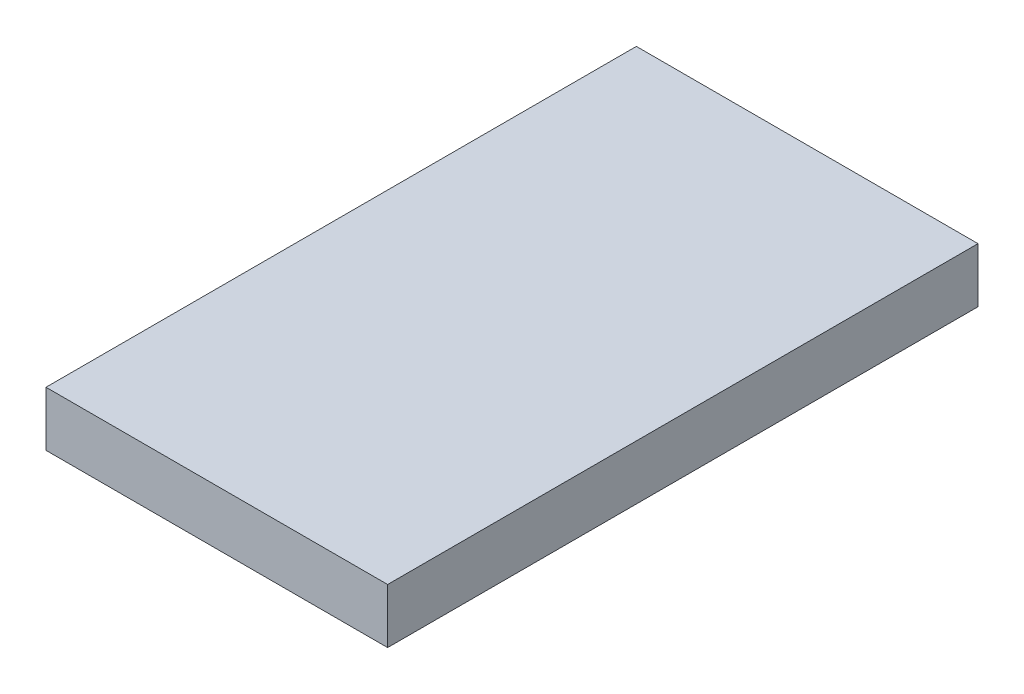
ISO-10303-21;
HEADER;
FILE_DESCRIPTION(('STEP AP214'),'2;1');
FILE_NAME('part.step','',(''),(''),'','','');
FILE_SCHEMA(('AUTOMOTIVE_DESIGN { 1 0 10303 214 1 1 1 1 }'));
ENDSEC;
DATA;
#1=APPLICATION_CONTEXT('core data for automotive mechanical design processes');
#2=APPLICATION_PROTOCOL_DEFINITION('international standard','automotive_design',2000,#1);
#3=PRODUCT_CONTEXT('',#1,'mechanical');
#4=PRODUCT('Part','Part','',(#3));
#5=PRODUCT_RELATED_PRODUCT_CATEGORY('part','',(#4));
#6=PRODUCT_DEFINITION_FORMATION('','',#4);
#7=PRODUCT_DEFINITION_CONTEXT('part definition',#1,'design');
#8=PRODUCT_DEFINITION('design','',#6,#7);
#9=PRODUCT_DEFINITION_SHAPE('','',#8);
#10=(LENGTH_UNIT() NAMED_UNIT(*) SI_UNIT(.MILLI.,.METRE.));
#11=(NAMED_UNIT(*) PLANE_ANGLE_UNIT() SI_UNIT($,.RADIAN.));
#12=(NAMED_UNIT(*) SI_UNIT($,.STERADIAN.) SOLID_ANGLE_UNIT());
#13=UNCERTAINTY_MEASURE_WITH_UNIT(LENGTH_MEASURE(1.E-05),#10,'distance_accuracy_value','');
#14=(GEOMETRIC_REPRESENTATION_CONTEXT(3) GLOBAL_UNCERTAINTY_ASSIGNED_CONTEXT((#13)) GLOBAL_UNIT_ASSIGNED_CONTEXT((#10,
#11,#12)) REPRESENTATION_CONTEXT('',''));
#15=CARTESIAN_POINT('',(0.,0.,0.));
#16=DIRECTION('',(0.,0.,1.));
#17=DIRECTION('',(1.,0.,0.));
#18=AXIS2_PLACEMENT_3D('',#15,#16,#17);
#19=CARTESIAN_POINT('',(7.45240332378656,1.6,5.1968587106806));
#20=DIRECTION('',(1.,0.,0.));
#21=DIRECTION('',(0.,0.,-1.));
#22=AXIS2_PLACEMENT_3D('',#19,#20,#21);
#23=PLANE('',#22);
#24=DIRECTION('',(0.,0.,1.));
#25=VECTOR('',#24,1.);
#26=CARTESIAN_POINT('',(7.45240332378656,0.,5.1968587106806));
#27=LINE('',#26,#25);
#28=CARTESIAN_POINT('',(7.45240332378656,0.,5.1968587106806));
#29=VERTEX_POINT('',#28);
#30=CARTESIAN_POINT('',(7.45240332378657,0.,22.4776265155889));
#31=VERTEX_POINT('',#30);
#32=EDGE_CURVE('E337',#29,#31,#27,.T.);
#33=ORIENTED_EDGE('',*,*,#32,.T.);
#34=DIRECTION('',(0.,-1.,0.));
#35=VECTOR('',#34,1.);
#36=CARTESIAN_POINT('',(7.45240332378657,1.6,22.4776265155889));
#37=LINE('',#36,#35);
#38=CARTESIAN_POINT('',(7.45240332378657,1.6,22.4776265155889));
#39=VERTEX_POINT('',#38);
#40=EDGE_CURVE('E11',#39,#31,#37,.T.);
#41=ORIENTED_EDGE('',*,*,#40,.F.);
#42=DIRECTION('',(0.,0.,1.));
#43=VECTOR('',#42,1.);
#44=CARTESIAN_POINT('',(7.45240332378656,1.6,5.1968587106806));
#45=LINE('',#44,#43);
#46=CARTESIAN_POINT('',(7.45240332378656,1.6,5.1968587106806));
#47=VERTEX_POINT('',#46);
#48=EDGE_CURVE('E373',#47,#39,#45,.T.);
#49=ORIENTED_EDGE('',*,*,#48,.F.);
#50=DIRECTION('',(0.,-1.,0.));
#51=VECTOR('',#50,1.);
#52=CARTESIAN_POINT('',(7.45240332378656,1.6,5.1968587106806));
#53=LINE('',#52,#51);
#54=EDGE_CURVE('E379',#47,#29,#53,.T.);
#55=ORIENTED_EDGE('',*,*,#54,.T.);
#56=EDGE_LOOP('',(#33,#41,#49,#55));
#57=FACE_BOUND('',#56,.T.);
#58=ADVANCED_FACE('F34',(#57),#23,.F.);
#59=CARTESIAN_POINT('',(7.45240332378657,1.6,22.4776265155889));
#60=DIRECTION('',(0.,0.,-1.));
#61=DIRECTION('',(-1.,0.,0.));
#62=AXIS2_PLACEMENT_3D('',#59,#60,#61);
#63=PLANE('',#62);
#64=DIRECTION('',(1.,0.,0.));
#65=VECTOR('',#64,1.);
#66=CARTESIAN_POINT('',(7.45240332378657,0.,22.4776265155889));
#67=LINE('',#66,#65);
#68=CARTESIAN_POINT('',(17.4524033237866,0.,22.4776265155889));
#69=VERTEX_POINT('',#68);
#70=EDGE_CURVE('E382',#31,#69,#67,.T.);
#71=ORIENTED_EDGE('',*,*,#70,.T.);
#72=DIRECTION('',(0.,-1.,0.));
#73=VECTOR('',#72,1.);
#74=CARTESIAN_POINT('',(17.4524033237866,1.6,22.4776265155889));
#75=LINE('',#74,#73);
#76=CARTESIAN_POINT('',(17.4524033237866,1.6,22.4776265155889));
#77=VERTEX_POINT('',#76);
#78=EDGE_CURVE('E41',#77,#69,#75,.T.);
#79=ORIENTED_EDGE('',*,*,#78,.F.);
#80=DIRECTION('',(1.,0.,0.));
#81=VECTOR('',#80,1.);
#82=CARTESIAN_POINT('',(7.45240332378657,1.6,22.4776265155889));
#83=LINE('',#82,#81);
#84=EDGE_CURVE('E85',#39,#77,#83,.T.);
#85=ORIENTED_EDGE('',*,*,#84,.F.);
#86=ORIENTED_EDGE('',*,*,#40,.T.);
#87=EDGE_LOOP('',(#71,#79,#85,#86));
#88=FACE_BOUND('',#87,.T.);
#89=ADVANCED_FACE('F410',(#88),#63,.F.);
#90=CARTESIAN_POINT('',(17.4524033237866,1.6,5.1968587106806));
#91=DIRECTION('',(-1.,0.,0.));
#92=DIRECTION('',(0.,0.,1.));
#93=AXIS2_PLACEMENT_3D('',#90,#91,#92);
#94=PLANE('',#93);
#95=DIRECTION('',(0.,0.,-1.));
#96=VECTOR('',#95,1.);
#97=CARTESIAN_POINT('',(17.4524033237866,0.,5.1968587106806));
#98=LINE('',#97,#96);
#99=CARTESIAN_POINT('',(17.4524033237866,0.,5.1968587106806));
#100=VERTEX_POINT('',#99);
#101=EDGE_CURVE('E384',#69,#100,#98,.T.);
#102=ORIENTED_EDGE('',*,*,#101,.T.);
#103=DIRECTION('',(0.,-1.,0.));
#104=VECTOR('',#103,1.);
#105=CARTESIAN_POINT('',(17.4524033237866,1.6,5.1968587106806));
#106=LINE('',#105,#104);
#107=CARTESIAN_POINT('',(17.4524033237866,1.6,5.1968587106806));
#108=VERTEX_POINT('',#107);
#109=EDGE_CURVE('E388',#108,#100,#106,.T.);
#110=ORIENTED_EDGE('',*,*,#109,.F.);
#111=DIRECTION('',(0.,0.,-1.));
#112=VECTOR('',#111,1.);
#113=CARTESIAN_POINT('',(17.4524033237866,1.6,5.1968587106806));
#114=LINE('',#113,#112);
#115=EDGE_CURVE('E376',#77,#108,#114,.T.);
#116=ORIENTED_EDGE('',*,*,#115,.F.);
#117=ORIENTED_EDGE('',*,*,#78,.T.);
#118=EDGE_LOOP('',(#102,#110,#116,#117));
#119=FACE_BOUND('',#118,.T.);
#120=ADVANCED_FACE('F393',(#119),#94,.F.);
#121=CARTESIAN_POINT('',(7.45240332378656,1.6,5.1968587106806));
#122=DIRECTION('',(0.,0.,1.));
#123=DIRECTION('',(1.,0.,0.));
#124=AXIS2_PLACEMENT_3D('',#121,#122,#123);
#125=PLANE('',#124);
#126=DIRECTION('',(-1.,0.,0.));
#127=VECTOR('',#126,1.);
#128=CARTESIAN_POINT('',(7.45240332378656,0.,5.1968587106806));
#129=LINE('',#128,#127);
#130=EDGE_CURVE('E78',#100,#29,#129,.T.);
#131=ORIENTED_EDGE('',*,*,#130,.T.);
#132=ORIENTED_EDGE('',*,*,#54,.F.);
#133=DIRECTION('',(-1.,0.,0.));
#134=VECTOR('',#133,1.);
#135=CARTESIAN_POINT('',(7.45240332378656,1.6,5.1968587106806));
#136=LINE('',#135,#134);
#137=EDGE_CURVE('E57',#108,#47,#136,.T.);
#138=ORIENTED_EDGE('',*,*,#137,.F.);
#139=ORIENTED_EDGE('',*,*,#109,.T.);
#140=EDGE_LOOP('',(#131,#132,#138,#139));
#141=FACE_BOUND('',#140,.T.);
#142=ADVANCED_FACE('F401',(#141),#125,.F.);
#143=CARTESIAN_POINT('',(0.,1.6,0.));
#144=DIRECTION('',(0.,1.,0.));
#145=DIRECTION('',(0.,0.,1.));
#146=AXIS2_PLACEMENT_3D('',#143,#144,#145);
#147=PLANE('',#146);
#148=ORIENTED_EDGE('',*,*,#48,.T.);
#149=ORIENTED_EDGE('',*,*,#84,.T.);
#150=ORIENTED_EDGE('',*,*,#115,.T.);
#151=ORIENTED_EDGE('',*,*,#137,.T.);
#152=EDGE_LOOP('',(#148,#149,#150,#151));
#153=FACE_BOUND('',#152,.T.);
#154=ADVANCED_FACE('F403',(#153),#147,.T.);
#155=CARTESIAN_POINT('',(0.,0.,0.));
#156=DIRECTION('',(0.,1.,0.));
#157=DIRECTION('',(0.,0.,1.));
#158=AXIS2_PLACEMENT_3D('',#155,#156,#157);
#159=PLANE('',#158);
#160=DIRECTION('',(0.,0.,1.));
#161=VECTOR('',#160,1.);
#162=CARTESIAN_POINT('',(8.45240332378656,0.,9.29743082704826));
#163=LINE('',#162,#161);
#164=CARTESIAN_POINT('',(8.45240332378656,0.,9.29743082704826));
#165=VERTEX_POINT('',#164);
#166=CARTESIAN_POINT('',(8.45240332378656,0.,13.335385211155));
#167=VERTEX_POINT('',#166);
#168=EDGE_CURVE('E229',#165,#167,#163,.T.);
#169=ORIENTED_EDGE('',*,*,#168,.T.);
#170=DIRECTION('',(1.,0.,0.));
#171=VECTOR('',#170,1.);
#172=CARTESIAN_POINT('',(8.45240332378656,0.,13.335385211155));
#173=LINE('',#172,#171);
#174=CARTESIAN_POINT('',(15.7832133663613,0.,13.335385211155));
#175=VERTEX_POINT('',#174);
#176=EDGE_CURVE('E285',#167,#175,#173,.T.);
#177=ORIENTED_EDGE('',*,*,#176,.T.);
#178=DIRECTION('',(0.,0.,1.));
#179=VECTOR('',#178,1.);
#180=CARTESIAN_POINT('',(15.7832133663613,0.,13.335385211155));
#181=LINE('',#180,#179);
#182=CARTESIAN_POINT('',(15.7832133663613,0.,15.5947168308338));
#183=VERTEX_POINT('',#182);
#184=EDGE_CURVE('E208',#175,#183,#181,.T.);
#185=ORIENTED_EDGE('',*,*,#184,.T.);
#186=DIRECTION('',(-1.,0.,0.));
#187=VECTOR('',#186,1.);
#188=CARTESIAN_POINT('',(15.7832133663613,0.,15.5947168308338));
#189=LINE('',#188,#187);
#190=CARTESIAN_POINT('',(9.29364382047547,0.,15.5947168308338));
#191=VERTEX_POINT('',#190);
#192=EDGE_CURVE('E48',#183,#191,#189,.T.);
#193=ORIENTED_EDGE('',*,*,#192,.T.);
#194=DIRECTION('',(0.,0.,1.));
#195=VECTOR('',#194,1.);
#196=CARTESIAN_POINT('',(9.29364382047547,0.,15.5947168308338));
#197=LINE('',#196,#195);
#198=CARTESIAN_POINT('',(9.29364382047547,0.,16.4776265155889));
#199=VERTEX_POINT('',#198);
#200=EDGE_CURVE('E289',#191,#199,#197,.T.);
#201=ORIENTED_EDGE('',*,*,#200,.T.);
#202=DIRECTION('',(1.,0.,0.));
#203=VECTOR('',#202,1.);
#204=CARTESIAN_POINT('',(9.29364382047547,0.,16.4776265155889));
#205=LINE('',#204,#203);
#206=CARTESIAN_POINT('',(12.2738820106732,0.,16.4776265155889));
#207=VERTEX_POINT('',#206);
#208=EDGE_CURVE('E292',#199,#207,#205,.T.);
#209=ORIENTED_EDGE('',*,*,#208,.T.);
#210=DIRECTION('',(0.,0.,1.));
#211=VECTOR('',#210,1.);
#212=CARTESIAN_POINT('',(12.2738820106732,0.,16.4776265155889));
#213=LINE('',#212,#211);
#214=CARTESIAN_POINT('',(12.2738820106732,0.,21.4776265155889));
#215=VERTEX_POINT('',#214);
#216=EDGE_CURVE('E295',#207,#215,#213,.T.);
#217=ORIENTED_EDGE('',*,*,#216,.T.);
#218=DIRECTION('',(1.,0.,0.));
#219=VECTOR('',#218,1.);
#220=CARTESIAN_POINT('',(12.2738820106732,0.,21.4776265155889));
#221=LINE('',#220,#219);
#222=CARTESIAN_POINT('',(12.8840931791241,0.,21.4776265155889));
#223=VERTEX_POINT('',#222);
#224=EDGE_CURVE('E298',#215,#223,#221,.T.);
#225=ORIENTED_EDGE('',*,*,#224,.T.);
#226=DIRECTION('',(0.,0.,-1.));
#227=VECTOR('',#226,1.);
#228=CARTESIAN_POINT('',(12.8840931791241,0.,21.4776265155889));
#229=LINE('',#228,#227);
#230=CARTESIAN_POINT('',(12.8840931791241,0.,16.4776265155889));
#231=VERTEX_POINT('',#230);
#232=EDGE_CURVE('E301',#223,#231,#229,.T.);
#233=ORIENTED_EDGE('',*,*,#232,.T.);
#234=DIRECTION('',(1.,0.,0.));
#235=VECTOR('',#234,1.);
#236=CARTESIAN_POINT('',(12.8840931791241,0.,16.4776265155889));
#237=LINE('',#236,#235);
#238=CARTESIAN_POINT('',(16.6185560128523,0.,16.4776265155889));
#239=VERTEX_POINT('',#238);
#240=EDGE_CURVE('E304',#231,#239,#237,.T.);
#241=ORIENTED_EDGE('',*,*,#240,.T.);
#242=DIRECTION('',(0.,0.,-1.));
#243=VECTOR('',#242,1.);
#244=CARTESIAN_POINT('',(16.6185560128523,0.,16.4776265155889));
#245=LINE('',#244,#243);
#246=CARTESIAN_POINT('',(16.6185560128523,0.,12.4220383861785));
#247=VERTEX_POINT('',#246);
#248=EDGE_CURVE('E307',#239,#247,#245,.T.);
#249=ORIENTED_EDGE('',*,*,#248,.T.);
#250=DIRECTION('',(-1.,0.,0.));
#251=VECTOR('',#250,1.);
#252=CARTESIAN_POINT('',(16.6185560128523,0.,12.4220383861785));
#253=LINE('',#252,#251);
#254=CARTESIAN_POINT('',(9.29364382047547,0.,12.4220383861785));
#255=VERTEX_POINT('',#254);
#256=EDGE_CURVE('E310',#247,#255,#253,.T.);
#257=ORIENTED_EDGE('',*,*,#256,.T.);
#258=DIRECTION('',(0.,0.,-1.));
#259=VECTOR('',#258,1.);
#260=CARTESIAN_POINT('',(9.29364382047547,0.,12.4220383861785));
#261=LINE('',#260,#259);
#262=CARTESIAN_POINT('',(9.29364382047547,0.,10.2588485375499));
#263=VERTEX_POINT('',#262);
#264=EDGE_CURVE('E313',#255,#263,#261,.T.);
#265=ORIENTED_EDGE('',*,*,#264,.T.);
#266=DIRECTION('',(1.,0.,0.));
#267=VECTOR('',#266,1.);
#268=CARTESIAN_POINT('',(9.29364382047547,0.,10.2588485375499));
#269=LINE('',#268,#267);
#270=CARTESIAN_POINT('',(16.6185560128523,0.,10.2588485375499));
#271=VERTEX_POINT('',#270);
#272=EDGE_CURVE('E316',#263,#271,#269,.T.);
#273=ORIENTED_EDGE('',*,*,#272,.T.);
#274=DIRECTION('',(0.,0.,-1.));
#275=VECTOR('',#274,1.);
#276=CARTESIAN_POINT('',(16.6185560128523,0.,10.2588485375499));
#277=LINE('',#276,#275);
#278=CARTESIAN_POINT('',(16.6185560128523,0.,6.1968587106806));
#279=VERTEX_POINT('',#278);
#280=EDGE_CURVE('E319',#271,#279,#277,.T.);
#281=ORIENTED_EDGE('',*,*,#280,.T.);
#282=DIRECTION('',(-1.,0.,0.));
#283=VECTOR('',#282,1.);
#284=CARTESIAN_POINT('',(16.6185560128523,0.,6.1968587106806));
#285=LINE('',#284,#283);
#286=CARTESIAN_POINT('',(9.29364382047546,0.,6.1968587106806));
#287=VERTEX_POINT('',#286);
#288=EDGE_CURVE('E322',#279,#287,#285,.T.);
#289=ORIENTED_EDGE('',*,*,#288,.T.);
#290=DIRECTION('',(0.,0.,1.));
#291=VECTOR('',#290,1.);
#292=CARTESIAN_POINT('',(9.29364382047546,0.,6.1968587106806));
#293=LINE('',#292,#291);
#294=CARTESIAN_POINT('',(9.29364382047546,0.,7.13424097841966));
#295=VERTEX_POINT('',#294);
#296=EDGE_CURVE('E325',#287,#295,#293,.T.);
#297=ORIENTED_EDGE('',*,*,#296,.T.);
#298=DIRECTION('',(1.,0.,0.));
#299=VECTOR('',#298,1.);
#300=CARTESIAN_POINT('',(9.29364382047546,0.,7.13424097841966));
#301=LINE('',#300,#299);
#302=CARTESIAN_POINT('',(15.7832133663613,0.,7.13424097841966));
#303=VERTEX_POINT('',#302);
#304=EDGE_CURVE('E328',#295,#303,#301,.T.);
#305=ORIENTED_EDGE('',*,*,#304,.T.);
#306=DIRECTION('',(0.,0.,1.));
#307=VECTOR('',#306,1.);
#308=CARTESIAN_POINT('',(15.7832133663613,0.,7.13424097841966));
#309=LINE('',#308,#307);
#310=CARTESIAN_POINT('',(15.7832133663613,0.,9.29743082704826));
#311=VERTEX_POINT('',#310);
#312=EDGE_CURVE('E331',#303,#311,#309,.T.);
#313=ORIENTED_EDGE('',*,*,#312,.T.);
#314=DIRECTION('',(-1.,0.,0.));
#315=VECTOR('',#314,1.);
#316=CARTESIAN_POINT('',(15.7832133663613,0.,9.29743082704826));
#317=LINE('',#316,#315);
#318=EDGE_CURVE('E232',#311,#165,#317,.T.);
#319=ORIENTED_EDGE('',*,*,#318,.T.);
#320=EDGE_LOOP('',(#169,#177,#185,#193,#201,#209,#217,#225,#233,#241,#249,#257,#265,#273,#281,
#289,#297,#305,#313,#319));
#321=FACE_BOUND('',#320,.T.);
#322=ORIENTED_EDGE('',*,*,#32,.F.);
#323=ORIENTED_EDGE('',*,*,#130,.F.);
#324=ORIENTED_EDGE('',*,*,#101,.F.);
#325=ORIENTED_EDGE('',*,*,#70,.F.);
#326=EDGE_LOOP('',(#322,#323,#324,#325));
#327=FACE_BOUND('',#326,.T.);
#328=ADVANCED_FACE('F397',(#321,#327),#159,.F.);
#329=CARTESIAN_POINT('',(8.45240332378656,-0.01,13.335385211155));
#330=DIRECTION('',(0.,0.,1.));
#331=DIRECTION('',(1.,0.,0.));
#332=AXIS2_PLACEMENT_3D('',#329,#330,#331);
#333=PLANE('',#332);
#334=ORIENTED_EDGE('',*,*,#176,.F.);
#335=DIRECTION('',(0.,1.,0.));
#336=VECTOR('',#335,1.);
#337=CARTESIAN_POINT('',(8.45240332378656,-0.01,13.335385211155));
#338=LINE('',#337,#336);
#339=CARTESIAN_POINT('',(8.45240332378656,-0.01,13.335385211155));
#340=VERTEX_POINT('',#339);
#341=EDGE_CURVE('E228',#340,#167,#338,.T.);
#342=ORIENTED_EDGE('',*,*,#341,.F.);
#343=DIRECTION('',(1.,0.,0.));
#344=VECTOR('',#343,1.);
#345=CARTESIAN_POINT('',(8.45240332378656,-0.01,13.335385211155));
#346=LINE('',#345,#344);
#347=CARTESIAN_POINT('',(15.7832133663613,-0.01,13.335385211155));
#348=VERTEX_POINT('',#347);
#349=EDGE_CURVE('E221',#340,#348,#346,.T.);
#350=ORIENTED_EDGE('',*,*,#349,.T.);
#351=DIRECTION('',(0.,1.,0.));
#352=VECTOR('',#351,1.);
#353=CARTESIAN_POINT('',(15.7832133663613,-0.01,13.335385211155));
#354=LINE('',#353,#352);
#355=EDGE_CURVE('E203',#348,#175,#354,.T.);
#356=ORIENTED_EDGE('',*,*,#355,.T.);
#357=EDGE_LOOP('',(#334,#342,#350,#356));
#358=FACE_BOUND('',#357,.T.);
#359=ADVANCED_FACE('F227',(#358),#333,.T.);
#360=CARTESIAN_POINT('',(8.45240332378656,-0.01,9.29743082704826));
#361=DIRECTION('',(-1.,0.,0.));
#362=DIRECTION('',(0.,0.,1.));
#363=AXIS2_PLACEMENT_3D('',#360,#361,#362);
#364=PLANE('',#363);
#365=ORIENTED_EDGE('',*,*,#168,.F.);
#366=DIRECTION('',(0.,1.,0.));
#367=VECTOR('',#366,1.);
#368=CARTESIAN_POINT('',(8.45240332378656,-0.01,9.29743082704826));
#369=LINE('',#368,#367);
#370=CARTESIAN_POINT('',(8.45240332378656,-0.01,9.29743082704826));
#371=VERTEX_POINT('',#370);
#372=EDGE_CURVE('E338',#371,#165,#369,.T.);
#373=ORIENTED_EDGE('',*,*,#372,.F.);
#374=DIRECTION('',(0.,0.,1.));
#375=VECTOR('',#374,1.);
#376=CARTESIAN_POINT('',(8.45240332378656,-0.01,9.29743082704826));
#377=LINE('',#376,#375);
#378=EDGE_CURVE('E214',#371,#340,#377,.T.);
#379=ORIENTED_EDGE('',*,*,#378,.T.);
#380=ORIENTED_EDGE('',*,*,#341,.T.);
#381=EDGE_LOOP('',(#365,#373,#379,#380));
#382=FACE_BOUND('',#381,.T.);
#383=ADVANCED_FACE('F450',(#382),#364,.T.);
#384=CARTESIAN_POINT('',(15.7832133663613,-0.01,9.29743082704826));
#385=DIRECTION('',(0.,0.,-1.));
#386=DIRECTION('',(-1.,0.,0.));
#387=AXIS2_PLACEMENT_3D('',#384,#385,#386);
#388=PLANE('',#387);
#389=ORIENTED_EDGE('',*,*,#318,.F.);
#390=DIRECTION('',(0.,1.,0.));
#391=VECTOR('',#390,1.);
#392=CARTESIAN_POINT('',(15.7832133663613,-0.01,9.29743082704826));
#393=LINE('',#392,#391);
#394=CARTESIAN_POINT('',(15.7832133663613,-0.01,9.29743082704826));
#395=VERTEX_POINT('',#394);
#396=EDGE_CURVE('E340',#395,#311,#393,.T.);
#397=ORIENTED_EDGE('',*,*,#396,.F.);
#398=DIRECTION('',(-1.,0.,0.));
#399=VECTOR('',#398,1.);
#400=CARTESIAN_POINT('',(15.7832133663613,-0.01,9.29743082704826));
#401=LINE('',#400,#399);
#402=EDGE_CURVE('E281',#395,#371,#401,.T.);
#403=ORIENTED_EDGE('',*,*,#402,.T.);
#404=ORIENTED_EDGE('',*,*,#372,.T.);
#405=EDGE_LOOP('',(#389,#397,#403,#404));
#406=FACE_BOUND('',#405,.T.);
#407=ADVANCED_FACE('F459',(#406),#388,.T.);
#408=CARTESIAN_POINT('',(15.7832133663613,-0.01,7.13424097841966));
#409=DIRECTION('',(-1.,0.,0.));
#410=DIRECTION('',(0.,0.,1.));
#411=AXIS2_PLACEMENT_3D('',#408,#409,#410);
#412=PLANE('',#411);
#413=ORIENTED_EDGE('',*,*,#312,.F.);
#414=DIRECTION('',(0.,1.,0.));
#415=VECTOR('',#414,1.);
#416=CARTESIAN_POINT('',(15.7832133663613,-0.01,7.13424097841966));
#417=LINE('',#416,#415);
#418=CARTESIAN_POINT('',(15.7832133663613,-0.01,7.13424097841966));
#419=VERTEX_POINT('',#418);
#420=EDGE_CURVE('E342',#419,#303,#417,.T.);
#421=ORIENTED_EDGE('',*,*,#420,.F.);
#422=DIRECTION('',(0.,0.,1.));
#423=VECTOR('',#422,1.);
#424=CARTESIAN_POINT('',(15.7832133663613,-0.01,7.13424097841966));
#425=LINE('',#424,#423);
#426=EDGE_CURVE('E278',#419,#395,#425,.T.);
#427=ORIENTED_EDGE('',*,*,#426,.T.);
#428=ORIENTED_EDGE('',*,*,#396,.T.);
#429=EDGE_LOOP('',(#413,#421,#427,#428));
#430=FACE_BOUND('',#429,.T.);
#431=ADVANCED_FACE('F469',(#430),#412,.T.);
#432=CARTESIAN_POINT('',(9.29364382047546,-0.01,7.13424097841966));
#433=DIRECTION('',(0.,0.,1.));
#434=DIRECTION('',(1.,0.,0.));
#435=AXIS2_PLACEMENT_3D('',#432,#433,#434);
#436=PLANE('',#435);
#437=ORIENTED_EDGE('',*,*,#304,.F.);
#438=DIRECTION('',(0.,1.,0.));
#439=VECTOR('',#438,1.);
#440=CARTESIAN_POINT('',(9.29364382047546,-0.01,7.13424097841966));
#441=LINE('',#440,#439);
#442=CARTESIAN_POINT('',(9.29364382047546,-0.01,7.13424097841966));
#443=VERTEX_POINT('',#442);
#444=EDGE_CURVE('E344',#443,#295,#441,.T.);
#445=ORIENTED_EDGE('',*,*,#444,.F.);
#446=DIRECTION('',(1.,0.,0.));
#447=VECTOR('',#446,1.);
#448=CARTESIAN_POINT('',(9.29364382047546,-0.01,7.13424097841966));
#449=LINE('',#448,#447);
#450=EDGE_CURVE('E275',#443,#419,#449,.T.);
#451=ORIENTED_EDGE('',*,*,#450,.T.);
#452=ORIENTED_EDGE('',*,*,#420,.T.);
#453=EDGE_LOOP('',(#437,#445,#451,#452));
#454=FACE_BOUND('',#453,.T.);
#455=ADVANCED_FACE('F479',(#454),#436,.T.);
#456=CARTESIAN_POINT('',(9.29364382047546,-0.01,6.1968587106806));
#457=DIRECTION('',(-1.,0.,0.));
#458=DIRECTION('',(0.,0.,1.));
#459=AXIS2_PLACEMENT_3D('',#456,#457,#458);
#460=PLANE('',#459);
#461=ORIENTED_EDGE('',*,*,#296,.F.);
#462=DIRECTION('',(0.,1.,0.));
#463=VECTOR('',#462,1.);
#464=CARTESIAN_POINT('',(9.29364382047546,-0.01,6.1968587106806));
#465=LINE('',#464,#463);
#466=CARTESIAN_POINT('',(9.29364382047546,-0.01,6.1968587106806));
#467=VERTEX_POINT('',#466);
#468=EDGE_CURVE('E346',#467,#287,#465,.T.);
#469=ORIENTED_EDGE('',*,*,#468,.F.);
#470=DIRECTION('',(0.,0.,1.));
#471=VECTOR('',#470,1.);
#472=CARTESIAN_POINT('',(9.29364382047546,-0.01,6.1968587106806));
#473=LINE('',#472,#471);
#474=EDGE_CURVE('E272',#467,#443,#473,.T.);
#475=ORIENTED_EDGE('',*,*,#474,.T.);
#476=ORIENTED_EDGE('',*,*,#444,.T.);
#477=EDGE_LOOP('',(#461,#469,#475,#476));
#478=FACE_BOUND('',#477,.T.);
#479=ADVANCED_FACE('F489',(#478),#460,.T.);
#480=CARTESIAN_POINT('',(16.6185560128523,-0.01,6.1968587106806));
#481=DIRECTION('',(0.,0.,-1.));
#482=DIRECTION('',(-1.,0.,0.));
#483=AXIS2_PLACEMENT_3D('',#480,#481,#482);
#484=PLANE('',#483);
#485=ORIENTED_EDGE('',*,*,#288,.F.);
#486=DIRECTION('',(0.,1.,0.));
#487=VECTOR('',#486,1.);
#488=CARTESIAN_POINT('',(16.6185560128523,-0.01,6.1968587106806));
#489=LINE('',#488,#487);
#490=CARTESIAN_POINT('',(16.6185560128523,-0.01,6.1968587106806));
#491=VERTEX_POINT('',#490);
#492=EDGE_CURVE('E348',#491,#279,#489,.T.);
#493=ORIENTED_EDGE('',*,*,#492,.F.);
#494=DIRECTION('',(-1.,0.,0.));
#495=VECTOR('',#494,1.);
#496=CARTESIAN_POINT('',(16.6185560128523,-0.01,6.1968587106806));
#497=LINE('',#496,#495);
#498=EDGE_CURVE('E269',#491,#467,#497,.T.);
#499=ORIENTED_EDGE('',*,*,#498,.T.);
#500=ORIENTED_EDGE('',*,*,#468,.T.);
#501=EDGE_LOOP('',(#485,#493,#499,#500));
#502=FACE_BOUND('',#501,.T.);
#503=ADVANCED_FACE('F499',(#502),#484,.T.);
#504=CARTESIAN_POINT('',(16.6185560128523,-0.01,10.2588485375499));
#505=DIRECTION('',(1.,0.,0.));
#506=DIRECTION('',(0.,0.,-1.));
#507=AXIS2_PLACEMENT_3D('',#504,#505,#506);
#508=PLANE('',#507);
#509=ORIENTED_EDGE('',*,*,#280,.F.);
#510=DIRECTION('',(0.,1.,0.));
#511=VECTOR('',#510,1.);
#512=CARTESIAN_POINT('',(16.6185560128523,-0.01,10.2588485375499));
#513=LINE('',#512,#511);
#514=CARTESIAN_POINT('',(16.6185560128523,-0.01,10.2588485375499));
#515=VERTEX_POINT('',#514);
#516=EDGE_CURVE('E350',#515,#271,#513,.T.);
#517=ORIENTED_EDGE('',*,*,#516,.F.);
#518=DIRECTION('',(0.,0.,-1.));
#519=VECTOR('',#518,1.);
#520=CARTESIAN_POINT('',(16.6185560128523,-0.01,10.2588485375499));
#521=LINE('',#520,#519);
#522=EDGE_CURVE('E266',#515,#491,#521,.T.);
#523=ORIENTED_EDGE('',*,*,#522,.T.);
#524=ORIENTED_EDGE('',*,*,#492,.T.);
#525=EDGE_LOOP('',(#509,#517,#523,#524));
#526=FACE_BOUND('',#525,.T.);
#527=ADVANCED_FACE('F509',(#526),#508,.T.);
#528=CARTESIAN_POINT('',(9.29364382047547,-0.01,10.2588485375499));
#529=DIRECTION('',(0.,0.,1.));
#530=DIRECTION('',(1.,0.,0.));
#531=AXIS2_PLACEMENT_3D('',#528,#529,#530);
#532=PLANE('',#531);
#533=ORIENTED_EDGE('',*,*,#272,.F.);
#534=DIRECTION('',(0.,1.,0.));
#535=VECTOR('',#534,1.);
#536=CARTESIAN_POINT('',(9.29364382047547,-0.01,10.2588485375499));
#537=LINE('',#536,#535);
#538=CARTESIAN_POINT('',(9.29364382047547,-0.01,10.2588485375499));
#539=VERTEX_POINT('',#538);
#540=EDGE_CURVE('E352',#539,#263,#537,.T.);
#541=ORIENTED_EDGE('',*,*,#540,.F.);
#542=DIRECTION('',(1.,0.,0.));
#543=VECTOR('',#542,1.);
#544=CARTESIAN_POINT('',(9.29364382047547,-0.01,10.2588485375499));
#545=LINE('',#544,#543);
#546=EDGE_CURVE('E263',#539,#515,#545,.T.);
#547=ORIENTED_EDGE('',*,*,#546,.T.);
#548=ORIENTED_EDGE('',*,*,#516,.T.);
#549=EDGE_LOOP('',(#533,#541,#547,#548));
#550=FACE_BOUND('',#549,.T.);
#551=ADVANCED_FACE('F519',(#550),#532,.T.);
#552=CARTESIAN_POINT('',(9.29364382047547,-0.01,12.4220383861785));
#553=DIRECTION('',(1.,0.,0.));
#554=DIRECTION('',(0.,0.,-1.));
#555=AXIS2_PLACEMENT_3D('',#552,#553,#554);
#556=PLANE('',#555);
#557=ORIENTED_EDGE('',*,*,#264,.F.);
#558=DIRECTION('',(0.,1.,0.));
#559=VECTOR('',#558,1.);
#560=CARTESIAN_POINT('',(9.29364382047547,-0.01,12.4220383861785));
#561=LINE('',#560,#559);
#562=CARTESIAN_POINT('',(9.29364382047547,-0.01,12.4220383861785));
#563=VERTEX_POINT('',#562);
#564=EDGE_CURVE('E354',#563,#255,#561,.T.);
#565=ORIENTED_EDGE('',*,*,#564,.F.);
#566=DIRECTION('',(0.,0.,-1.));
#567=VECTOR('',#566,1.);
#568=CARTESIAN_POINT('',(9.29364382047547,-0.01,12.4220383861785));
#569=LINE('',#568,#567);
#570=EDGE_CURVE('E260',#563,#539,#569,.T.);
#571=ORIENTED_EDGE('',*,*,#570,.T.);
#572=ORIENTED_EDGE('',*,*,#540,.T.);
#573=EDGE_LOOP('',(#557,#565,#571,#572));
#574=FACE_BOUND('',#573,.T.);
#575=ADVANCED_FACE('F529',(#574),#556,.T.);
#576=CARTESIAN_POINT('',(16.6185560128523,-0.01,12.4220383861785));
#577=DIRECTION('',(0.,0.,-1.));
#578=DIRECTION('',(-1.,0.,0.));
#579=AXIS2_PLACEMENT_3D('',#576,#577,#578);
#580=PLANE('',#579);
#581=ORIENTED_EDGE('',*,*,#256,.F.);
#582=DIRECTION('',(0.,1.,0.));
#583=VECTOR('',#582,1.);
#584=CARTESIAN_POINT('',(16.6185560128523,-0.01,12.4220383861785));
#585=LINE('',#584,#583);
#586=CARTESIAN_POINT('',(16.6185560128523,-0.01,12.4220383861785));
#587=VERTEX_POINT('',#586);
#588=EDGE_CURVE('E356',#587,#247,#585,.T.);
#589=ORIENTED_EDGE('',*,*,#588,.F.);
#590=DIRECTION('',(-1.,0.,0.));
#591=VECTOR('',#590,1.);
#592=CARTESIAN_POINT('',(16.6185560128523,-0.01,12.4220383861785));
#593=LINE('',#592,#591);
#594=EDGE_CURVE('E257',#587,#563,#593,.T.);
#595=ORIENTED_EDGE('',*,*,#594,.T.);
#596=ORIENTED_EDGE('',*,*,#564,.T.);
#597=EDGE_LOOP('',(#581,#589,#595,#596));
#598=FACE_BOUND('',#597,.T.);
#599=ADVANCED_FACE('F539',(#598),#580,.T.);
#600=CARTESIAN_POINT('',(16.6185560128523,-0.01,16.4776265155889));
#601=DIRECTION('',(1.,0.,0.));
#602=DIRECTION('',(0.,0.,-1.));
#603=AXIS2_PLACEMENT_3D('',#600,#601,#602);
#604=PLANE('',#603);
#605=ORIENTED_EDGE('',*,*,#248,.F.);
#606=DIRECTION('',(0.,1.,0.));
#607=VECTOR('',#606,1.);
#608=CARTESIAN_POINT('',(16.6185560128523,-0.01,16.4776265155889));
#609=LINE('',#608,#607);
#610=CARTESIAN_POINT('',(16.6185560128523,-0.01,16.4776265155889));
#611=VERTEX_POINT('',#610);
#612=EDGE_CURVE('E358',#611,#239,#609,.T.);
#613=ORIENTED_EDGE('',*,*,#612,.F.);
#614=DIRECTION('',(0.,0.,-1.));
#615=VECTOR('',#614,1.);
#616=CARTESIAN_POINT('',(16.6185560128523,-0.01,16.4776265155889));
#617=LINE('',#616,#615);
#618=EDGE_CURVE('E254',#611,#587,#617,.T.);
#619=ORIENTED_EDGE('',*,*,#618,.T.);
#620=ORIENTED_EDGE('',*,*,#588,.T.);
#621=EDGE_LOOP('',(#605,#613,#619,#620));
#622=FACE_BOUND('',#621,.T.);
#623=ADVANCED_FACE('F549',(#622),#604,.T.);
#624=CARTESIAN_POINT('',(12.8840931791241,-0.01,16.4776265155889));
#625=DIRECTION('',(0.,0.,1.));
#626=DIRECTION('',(1.,0.,0.));
#627=AXIS2_PLACEMENT_3D('',#624,#625,#626);
#628=PLANE('',#627);
#629=ORIENTED_EDGE('',*,*,#240,.F.);
#630=DIRECTION('',(0.,1.,0.));
#631=VECTOR('',#630,1.);
#632=CARTESIAN_POINT('',(12.8840931791241,-0.01,16.4776265155889));
#633=LINE('',#632,#631);
#634=CARTESIAN_POINT('',(12.8840931791241,-0.01,16.4776265155889));
#635=VERTEX_POINT('',#634);
#636=EDGE_CURVE('E360',#635,#231,#633,.T.);
#637=ORIENTED_EDGE('',*,*,#636,.F.);
#638=DIRECTION('',(1.,0.,0.));
#639=VECTOR('',#638,1.);
#640=CARTESIAN_POINT('',(12.8840931791241,-0.01,16.4776265155889));
#641=LINE('',#640,#639);
#642=EDGE_CURVE('E251',#635,#611,#641,.T.);
#643=ORIENTED_EDGE('',*,*,#642,.T.);
#644=ORIENTED_EDGE('',*,*,#612,.T.);
#645=EDGE_LOOP('',(#629,#637,#643,#644));
#646=FACE_BOUND('',#645,.T.);
#647=ADVANCED_FACE('F559',(#646),#628,.T.);
#648=CARTESIAN_POINT('',(12.8840931791241,-0.01,21.4776265155889));
#649=DIRECTION('',(1.,0.,0.));
#650=DIRECTION('',(0.,0.,-1.));
#651=AXIS2_PLACEMENT_3D('',#648,#649,#650);
#652=PLANE('',#651);
#653=ORIENTED_EDGE('',*,*,#232,.F.);
#654=DIRECTION('',(0.,1.,0.));
#655=VECTOR('',#654,1.);
#656=CARTESIAN_POINT('',(12.8840931791241,-0.01,21.4776265155889));
#657=LINE('',#656,#655);
#658=CARTESIAN_POINT('',(12.8840931791241,-0.01,21.4776265155889));
#659=VERTEX_POINT('',#658);
#660=EDGE_CURVE('E362',#659,#223,#657,.T.);
#661=ORIENTED_EDGE('',*,*,#660,.F.);
#662=DIRECTION('',(0.,0.,-1.));
#663=VECTOR('',#662,1.);
#664=CARTESIAN_POINT('',(12.8840931791241,-0.01,21.4776265155889));
#665=LINE('',#664,#663);
#666=EDGE_CURVE('E248',#659,#635,#665,.T.);
#667=ORIENTED_EDGE('',*,*,#666,.T.);
#668=ORIENTED_EDGE('',*,*,#636,.T.);
#669=EDGE_LOOP('',(#653,#661,#667,#668));
#670=FACE_BOUND('',#669,.T.);
#671=ADVANCED_FACE('F569',(#670),#652,.T.);
#672=CARTESIAN_POINT('',(12.2738820106732,-0.01,21.4776265155889));
#673=DIRECTION('',(0.,0.,1.));
#674=DIRECTION('',(1.,0.,0.));
#675=AXIS2_PLACEMENT_3D('',#672,#673,#674);
#676=PLANE('',#675);
#677=ORIENTED_EDGE('',*,*,#224,.F.);
#678=DIRECTION('',(0.,1.,0.));
#679=VECTOR('',#678,1.);
#680=CARTESIAN_POINT('',(12.2738820106732,-0.01,21.4776265155889));
#681=LINE('',#680,#679);
#682=CARTESIAN_POINT('',(12.2738820106732,-0.01,21.4776265155889));
#683=VERTEX_POINT('',#682);
#684=EDGE_CURVE('E364',#683,#215,#681,.T.);
#685=ORIENTED_EDGE('',*,*,#684,.F.);
#686=DIRECTION('',(1.,0.,0.));
#687=VECTOR('',#686,1.);
#688=CARTESIAN_POINT('',(12.2738820106732,-0.01,21.4776265155889));
#689=LINE('',#688,#687);
#690=EDGE_CURVE('E245',#683,#659,#689,.T.);
#691=ORIENTED_EDGE('',*,*,#690,.T.);
#692=ORIENTED_EDGE('',*,*,#660,.T.);
#693=EDGE_LOOP('',(#677,#685,#691,#692));
#694=FACE_BOUND('',#693,.T.);
#695=ADVANCED_FACE('F579',(#694),#676,.T.);
#696=CARTESIAN_POINT('',(12.2738820106732,-0.01,16.4776265155889));
#697=DIRECTION('',(-1.,0.,0.));
#698=DIRECTION('',(0.,0.,1.));
#699=AXIS2_PLACEMENT_3D('',#696,#697,#698);
#700=PLANE('',#699);
#701=ORIENTED_EDGE('',*,*,#216,.F.);
#702=DIRECTION('',(0.,1.,0.));
#703=VECTOR('',#702,1.);
#704=CARTESIAN_POINT('',(12.2738820106732,-0.01,16.4776265155889));
#705=LINE('',#704,#703);
#706=CARTESIAN_POINT('',(12.2738820106732,-0.01,16.4776265155889));
#707=VERTEX_POINT('',#706);
#708=EDGE_CURVE('E366',#707,#207,#705,.T.);
#709=ORIENTED_EDGE('',*,*,#708,.F.);
#710=DIRECTION('',(0.,0.,1.));
#711=VECTOR('',#710,1.);
#712=CARTESIAN_POINT('',(12.2738820106732,-0.01,16.4776265155889));
#713=LINE('',#712,#711);
#714=EDGE_CURVE('E242',#707,#683,#713,.T.);
#715=ORIENTED_EDGE('',*,*,#714,.T.);
#716=ORIENTED_EDGE('',*,*,#684,.T.);
#717=EDGE_LOOP('',(#701,#709,#715,#716));
#718=FACE_BOUND('',#717,.T.);
#719=ADVANCED_FACE('F589',(#718),#700,.T.);
#720=CARTESIAN_POINT('',(9.29364382047547,-0.01,16.4776265155889));
#721=DIRECTION('',(0.,0.,1.));
#722=DIRECTION('',(1.,0.,0.));
#723=AXIS2_PLACEMENT_3D('',#720,#721,#722);
#724=PLANE('',#723);
#725=ORIENTED_EDGE('',*,*,#208,.F.);
#726=DIRECTION('',(0.,1.,0.));
#727=VECTOR('',#726,1.);
#728=CARTESIAN_POINT('',(9.29364382047547,-0.01,16.4776265155889));
#729=LINE('',#728,#727);
#730=CARTESIAN_POINT('',(9.29364382047547,-0.01,16.4776265155889));
#731=VERTEX_POINT('',#730);
#732=EDGE_CURVE('E368',#731,#199,#729,.T.);
#733=ORIENTED_EDGE('',*,*,#732,.F.);
#734=DIRECTION('',(1.,0.,0.));
#735=VECTOR('',#734,1.);
#736=CARTESIAN_POINT('',(9.29364382047547,-0.01,16.4776265155889));
#737=LINE('',#736,#735);
#738=EDGE_CURVE('E239',#731,#707,#737,.T.);
#739=ORIENTED_EDGE('',*,*,#738,.T.);
#740=ORIENTED_EDGE('',*,*,#708,.T.);
#741=EDGE_LOOP('',(#725,#733,#739,#740));
#742=FACE_BOUND('',#741,.T.);
#743=ADVANCED_FACE('F599',(#742),#724,.T.);
#744=CARTESIAN_POINT('',(9.29364382047547,-0.01,15.5947168308338));
#745=DIRECTION('',(-1.,0.,0.));
#746=DIRECTION('',(0.,0.,1.));
#747=AXIS2_PLACEMENT_3D('',#744,#745,#746);
#748=PLANE('',#747);
#749=ORIENTED_EDGE('',*,*,#200,.F.);
#750=DIRECTION('',(0.,1.,0.));
#751=VECTOR('',#750,1.);
#752=CARTESIAN_POINT('',(9.29364382047547,-0.01,15.5947168308338));
#753=LINE('',#752,#751);
#754=CARTESIAN_POINT('',(9.29364382047547,-0.01,15.5947168308338));
#755=VERTEX_POINT('',#754);
#756=EDGE_CURVE('E370',#755,#191,#753,.T.);
#757=ORIENTED_EDGE('',*,*,#756,.F.);
#758=DIRECTION('',(0.,0.,1.));
#759=VECTOR('',#758,1.);
#760=CARTESIAN_POINT('',(9.29364382047547,-0.01,15.5947168308338));
#761=LINE('',#760,#759);
#762=EDGE_CURVE('E236',#755,#731,#761,.T.);
#763=ORIENTED_EDGE('',*,*,#762,.T.);
#764=ORIENTED_EDGE('',*,*,#732,.T.);
#765=EDGE_LOOP('',(#749,#757,#763,#764));
#766=FACE_BOUND('',#765,.T.);
#767=ADVANCED_FACE('F609',(#766),#748,.T.);
#768=CARTESIAN_POINT('',(15.7832133663613,-0.01,15.5947168308338));
#769=DIRECTION('',(0.,0.,-1.));
#770=DIRECTION('',(-1.,0.,0.));
#771=AXIS2_PLACEMENT_3D('',#768,#769,#770);
#772=PLANE('',#771);
#773=ORIENTED_EDGE('',*,*,#192,.F.);
#774=DIRECTION('',(0.,1.,0.));
#775=VECTOR('',#774,1.);
#776=CARTESIAN_POINT('',(15.7832133663613,-0.01,15.5947168308338));
#777=LINE('',#776,#775);
#778=CARTESIAN_POINT('',(15.7832133663613,-0.01,15.5947168308338));
#779=VERTEX_POINT('',#778);
#780=EDGE_CURVE('E213',#779,#183,#777,.T.);
#781=ORIENTED_EDGE('',*,*,#780,.F.);
#782=DIRECTION('',(-1.,0.,0.));
#783=VECTOR('',#782,1.);
#784=CARTESIAN_POINT('',(15.7832133663613,-0.01,15.5947168308338));
#785=LINE('',#784,#783);
#786=EDGE_CURVE('E225',#779,#755,#785,.T.);
#787=ORIENTED_EDGE('',*,*,#786,.T.);
#788=ORIENTED_EDGE('',*,*,#756,.T.);
#789=EDGE_LOOP('',(#773,#781,#787,#788));
#790=FACE_BOUND('',#789,.T.);
#791=ADVANCED_FACE('F619',(#790),#772,.T.);
#792=CARTESIAN_POINT('',(15.7832133663613,-0.01,13.335385211155));
#793=DIRECTION('',(-1.,0.,0.));
#794=DIRECTION('',(0.,0.,1.));
#795=AXIS2_PLACEMENT_3D('',#792,#793,#794);
#796=PLANE('',#795);
#797=ORIENTED_EDGE('',*,*,#184,.F.);
#798=ORIENTED_EDGE('',*,*,#355,.F.);
#799=DIRECTION('',(0.,0.,1.));
#800=VECTOR('',#799,1.);
#801=CARTESIAN_POINT('',(15.7832133663613,-0.01,13.335385211155));
#802=LINE('',#801,#800);
#803=EDGE_CURVE('E206',#348,#779,#802,.T.);
#804=ORIENTED_EDGE('',*,*,#803,.T.);
#805=ORIENTED_EDGE('',*,*,#780,.T.);
#806=EDGE_LOOP('',(#797,#798,#804,#805));
#807=FACE_BOUND('',#806,.T.);
#808=ADVANCED_FACE('F205',(#807),#796,.T.);
#809=CARTESIAN_POINT('',(0.,-0.01,0.));
#810=DIRECTION('',(0.,-1.,0.));
#811=DIRECTION('',(0.,0.,-1.));
#812=AXIS2_PLACEMENT_3D('',#809,#810,#811);
#813=PLANE('',#812);
#814=ORIENTED_EDGE('',*,*,#349,.F.);
#815=ORIENTED_EDGE('',*,*,#378,.F.);
#816=ORIENTED_EDGE('',*,*,#402,.F.);
#817=ORIENTED_EDGE('',*,*,#426,.F.);
#818=ORIENTED_EDGE('',*,*,#450,.F.);
#819=ORIENTED_EDGE('',*,*,#474,.F.);
#820=ORIENTED_EDGE('',*,*,#498,.F.);
#821=ORIENTED_EDGE('',*,*,#522,.F.);
#822=ORIENTED_EDGE('',*,*,#546,.F.);
#823=ORIENTED_EDGE('',*,*,#570,.F.);
#824=ORIENTED_EDGE('',*,*,#594,.F.);
#825=ORIENTED_EDGE('',*,*,#618,.F.);
#826=ORIENTED_EDGE('',*,*,#642,.F.);
#827=ORIENTED_EDGE('',*,*,#666,.F.);
#828=ORIENTED_EDGE('',*,*,#690,.F.);
#829=ORIENTED_EDGE('',*,*,#714,.F.);
#830=ORIENTED_EDGE('',*,*,#738,.F.);
#831=ORIENTED_EDGE('',*,*,#762,.F.);
#832=ORIENTED_EDGE('',*,*,#786,.F.);
#833=ORIENTED_EDGE('',*,*,#803,.F.);
#834=EDGE_LOOP('',(#814,#815,#816,#817,#818,#819,#820,#821,#822,#823,#824,#825,#826,#827,#828,
#829,#830,#831,#832,#833));
#835=FACE_BOUND('',#834,.T.);
#836=ADVANCED_FACE('F219',(#835),#813,.T.);
#837=CLOSED_SHELL('',(#58,#89,#120,#142,#154,#328,#359,#383,#407,#431,#455,#479,#503,#527,#551,
#575,#599,#623,#647,#671,#695,#719,#743,#767,#791,#808,#836));
#838=MANIFOLD_SOLID_BREP('B2',#837);
#839=ADVANCED_BREP_SHAPE_REPRESENTATION('',(#18,#838),#14);
#840=SHAPE_DEFINITION_REPRESENTATION(#9,#839);
ENDSEC;
END-ISO-10303-21;
